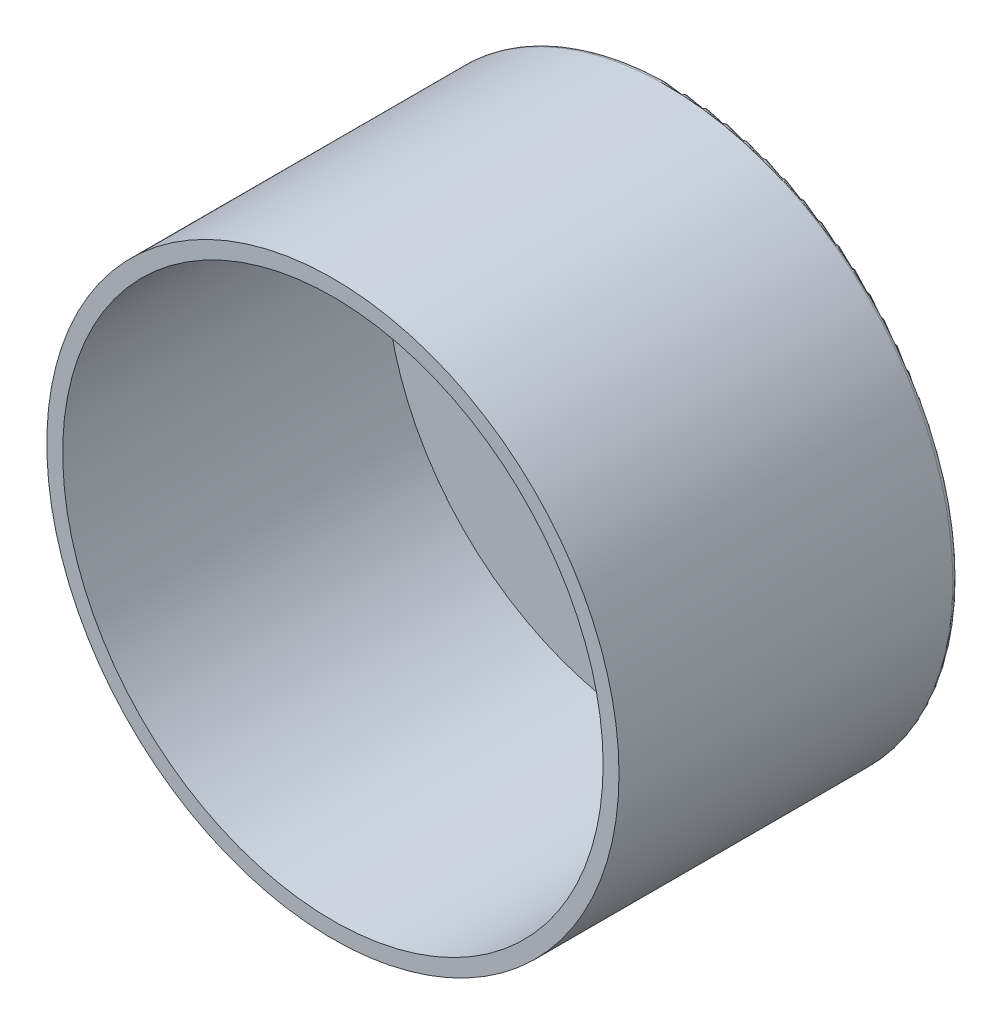
ISO-10303-21;
HEADER;
FILE_DESCRIPTION(('STEP AP214'),'2;1');
FILE_NAME('part.step','',(''),(''),'','','');
FILE_SCHEMA(('AUTOMOTIVE_DESIGN { 1 0 10303 214 1 1 1 1 }'));
ENDSEC;
DATA;
#1=APPLICATION_CONTEXT('core data for automotive mechanical design processes');
#2=APPLICATION_PROTOCOL_DEFINITION('international standard','automotive_design',2000,#1);
#3=PRODUCT_CONTEXT('',#1,'mechanical');
#4=PRODUCT('Part','Part','',(#3));
#5=PRODUCT_RELATED_PRODUCT_CATEGORY('part','',(#4));
#6=PRODUCT_DEFINITION_FORMATION('','',#4);
#7=PRODUCT_DEFINITION_CONTEXT('part definition',#1,'design');
#8=PRODUCT_DEFINITION('design','',#6,#7);
#9=PRODUCT_DEFINITION_SHAPE('','',#8);
#10=(LENGTH_UNIT() NAMED_UNIT(*) SI_UNIT(.MILLI.,.METRE.));
#11=(NAMED_UNIT(*) PLANE_ANGLE_UNIT() SI_UNIT($,.RADIAN.));
#12=(NAMED_UNIT(*) SI_UNIT($,.STERADIAN.) SOLID_ANGLE_UNIT());
#13=UNCERTAINTY_MEASURE_WITH_UNIT(LENGTH_MEASURE(1.E-05),#10,'distance_accuracy_value','');
#14=(GEOMETRIC_REPRESENTATION_CONTEXT(3) GLOBAL_UNCERTAINTY_ASSIGNED_CONTEXT((#13)) GLOBAL_UNIT_ASSIGNED_CONTEXT((#10,
#11,#12)) REPRESENTATION_CONTEXT('',''));
#15=CARTESIAN_POINT('',(0.,0.,0.));
#16=DIRECTION('',(0.,0.,1.));
#17=DIRECTION('',(1.,0.,0.));
#18=AXIS2_PLACEMENT_3D('',#15,#16,#17);
#19=CARTESIAN_POINT('',(0.,0.,32.));
#20=DIRECTION('',(0.,0.,-1.));
#21=DIRECTION('',(-1.,0.,0.));
#22=AXIS2_PLACEMENT_3D('',#19,#20,#21);
#23=CYLINDRICAL_SURFACE('',#22,27.);
#24=CARTESIAN_POINT('',(0.,0.,0.5));
#25=DIRECTION('',(0.,0.,1.));
#26=DIRECTION('',(1.,0.,0.));
#27=AXIS2_PLACEMENT_3D('',#24,#25,#26);
#28=CIRCLE('',#27,27.);
#29=CARTESIAN_POINT('',(27.,0.,0.5));
#30=VERTEX_POINT('',#29);
#31=EDGE_CURVE('E47',#30,#30,#28,.T.);
#32=ORIENTED_EDGE('',*,*,#31,.T.);
#33=EDGE_LOOP('',(#32));
#34=FACE_BOUND('',#33,.T.);
#35=CARTESIAN_POINT('',(0.,0.,32.));
#36=DIRECTION('',(0.,0.,1.));
#37=DIRECTION('',(1.,0.,0.));
#38=AXIS2_PLACEMENT_3D('',#35,#36,#37);
#39=CIRCLE('',#38,27.);
#40=CARTESIAN_POINT('',(27.,0.,32.));
#41=VERTEX_POINT('',#40);
#42=EDGE_CURVE('E52',#41,#41,#39,.T.);
#43=ORIENTED_EDGE('',*,*,#42,.F.);
#44=EDGE_LOOP('',(#43));
#45=FACE_BOUND('',#44,.T.);
#46=ADVANCED_FACE('F39',(#34,#45),#23,.T.);
#47=CARTESIAN_POINT('',(0.,0.,32.));
#48=DIRECTION('',(0.,0.,1.));
#49=DIRECTION('',(1.,0.,0.));
#50=AXIS2_PLACEMENT_3D('',#47,#48,#49);
#51=PLANE('',#50);
#52=CARTESIAN_POINT('',(0.,0.,32.));
#53=DIRECTION('',(0.,0.,1.));
#54=DIRECTION('',(1.,0.,0.));
#55=AXIS2_PLACEMENT_3D('',#52,#53,#54);
#56=CIRCLE('',#55,25.5);
#57=CARTESIAN_POINT('',(25.5,0.,32.));
#58=VERTEX_POINT('',#57);
#59=EDGE_CURVE('E57',#58,#58,#56,.T.);
#60=ORIENTED_EDGE('',*,*,#59,.F.);
#61=EDGE_LOOP('',(#60));
#62=FACE_BOUND('',#61,.T.);
#63=ORIENTED_EDGE('',*,*,#42,.T.);
#64=EDGE_LOOP('',(#63));
#65=FACE_BOUND('',#64,.T.);
#66=ADVANCED_FACE('F80',(#62,#65),#51,.T.);
#67=CARTESIAN_POINT('',(0.,0.,0.));
#68=DIRECTION('',(0.,0.,1.));
#69=DIRECTION('',(1.,0.,0.));
#70=AXIS2_PLACEMENT_3D('',#67,#68,#69);
#71=PLANE('',#70);
#72=CARTESIAN_POINT('',(0.,0.,0.));
#73=DIRECTION('',(0.,0.,1.));
#74=DIRECTION('',(1.,0.,0.));
#75=AXIS2_PLACEMENT_3D('',#72,#73,#74);
#76=CIRCLE('',#75,26.5);
#77=CARTESIAN_POINT('',(26.5,0.,0.));
#78=VERTEX_POINT('',#77);
#79=EDGE_CURVE('E10',#78,#78,#76,.F.);
#80=ORIENTED_EDGE('',*,*,#79,.T.);
#81=EDGE_LOOP('',(#80));
#82=FACE_BOUND('',#81,.T.);
#83=ADVANCED_FACE('F72',(#82),#71,.F.);
#84=CARTESIAN_POINT('',(0.,0.,32.));
#85=DIRECTION('',(0.,0.,-1.));
#86=DIRECTION('',(-1.,0.,0.));
#87=AXIS2_PLACEMENT_3D('',#84,#85,#86);
#88=CYLINDRICAL_SURFACE('',#87,25.5);
#89=ORIENTED_EDGE('',*,*,#59,.T.);
#90=EDGE_LOOP('',(#89));
#91=FACE_BOUND('',#90,.T.);
#92=CARTESIAN_POINT('',(0.,0.,1.5));
#93=DIRECTION('',(0.,0.,1.));
#94=DIRECTION('',(1.,0.,0.));
#95=AXIS2_PLACEMENT_3D('',#92,#93,#94);
#96=CIRCLE('',#95,25.5);
#97=CARTESIAN_POINT('',(25.5,0.,1.5));
#98=VERTEX_POINT('',#97);
#99=EDGE_CURVE('E63',#98,#98,#96,.T.);
#100=ORIENTED_EDGE('',*,*,#99,.F.);
#101=EDGE_LOOP('',(#100));
#102=FACE_BOUND('',#101,.T.);
#103=ADVANCED_FACE('F70',(#91,#102),#88,.F.);
#104=CARTESIAN_POINT('',(0.,0.,1.5));
#105=DIRECTION('',(0.,0.,1.));
#106=DIRECTION('',(1.,0.,0.));
#107=AXIS2_PLACEMENT_3D('',#104,#105,#106);
#108=PLANE('',#107);
#109=ORIENTED_EDGE('',*,*,#99,.T.);
#110=EDGE_LOOP('',(#109));
#111=FACE_BOUND('',#110,.T.);
#112=ADVANCED_FACE('F68',(#111),#108,.T.);
#113=CARTESIAN_POINT('',(0.,0.,0.5));
#114=DIRECTION('',(0.,0.,1.));
#115=DIRECTION('',(1.,0.,0.));
#116=AXIS2_PLACEMENT_3D('',#113,#114,#115);
#117=TOROIDAL_SURFACE('',#116,26.5,0.5);
#118=ORIENTED_EDGE('',*,*,#79,.F.);
#119=EDGE_LOOP('',(#118));
#120=FACE_BOUND('',#119,.T.);
#121=ORIENTED_EDGE('',*,*,#31,.F.);
#122=EDGE_LOOP('',(#121));
#123=FACE_BOUND('',#122,.T.);
#124=ADVANCED_FACE('F41',(#120,#123),#117,.T.);
#125=CLOSED_SHELL('',(#46,#66,#83,#103,#112,#124));
#126=MANIFOLD_SOLID_BREP('B2',#125);
#127=ADVANCED_BREP_SHAPE_REPRESENTATION('',(#18,#126),#14);
#128=SHAPE_DEFINITION_REPRESENTATION(#9,#127);
ENDSEC;
END-ISO-10303-21;
